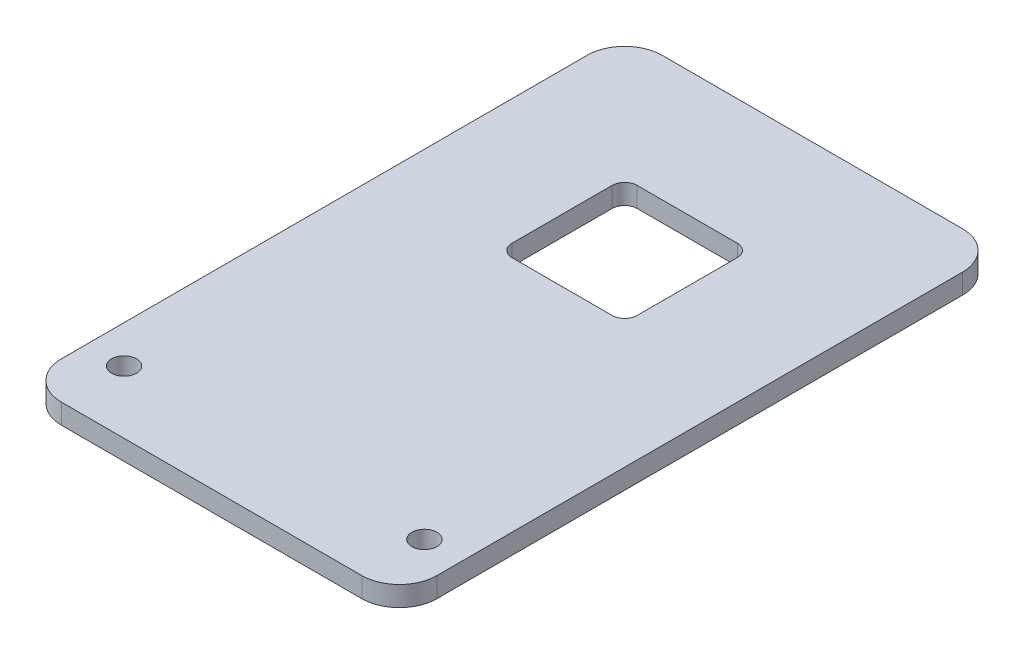
ISO-10303-21;
HEADER;
FILE_DESCRIPTION(('STEP AP214'),'2;1');
FILE_NAME('part.step','',(''),(''),'','','');
FILE_SCHEMA(('AUTOMOTIVE_DESIGN { 1 0 10303 214 1 1 1 1 }'));
ENDSEC;
DATA;
#1=APPLICATION_CONTEXT('core data for automotive mechanical design processes');
#2=APPLICATION_PROTOCOL_DEFINITION('international standard','automotive_design',2000,#1);
#3=PRODUCT_CONTEXT('',#1,'mechanical');
#4=PRODUCT('Part','Part','',(#3));
#5=PRODUCT_RELATED_PRODUCT_CATEGORY('part','',(#4));
#6=PRODUCT_DEFINITION_FORMATION('','',#4);
#7=PRODUCT_DEFINITION_CONTEXT('part definition',#1,'design');
#8=PRODUCT_DEFINITION('design','',#6,#7);
#9=PRODUCT_DEFINITION_SHAPE('','',#8);
#10=(LENGTH_UNIT() NAMED_UNIT(*) SI_UNIT(.MILLI.,.METRE.));
#11=(NAMED_UNIT(*) PLANE_ANGLE_UNIT() SI_UNIT($,.RADIAN.));
#12=(NAMED_UNIT(*) SI_UNIT($,.STERADIAN.) SOLID_ANGLE_UNIT());
#13=UNCERTAINTY_MEASURE_WITH_UNIT(LENGTH_MEASURE(1.E-05),#10,'distance_accuracy_value','');
#14=(GEOMETRIC_REPRESENTATION_CONTEXT(3) GLOBAL_UNCERTAINTY_ASSIGNED_CONTEXT((#13)) GLOBAL_UNIT_ASSIGNED_CONTEXT((#10,
#11,#12)) REPRESENTATION_CONTEXT('',''));
#15=CARTESIAN_POINT('',(0.,0.,0.));
#16=DIRECTION('',(0.,0.,1.));
#17=DIRECTION('',(1.,0.,0.));
#18=AXIS2_PLACEMENT_3D('',#15,#16,#17);
#19=CARTESIAN_POINT('',(0.,1.6,0.));
#20=DIRECTION('',(0.,-1.,0.));
#21=DIRECTION('',(0.,0.,-1.));
#22=AXIS2_PLACEMENT_3D('',#19,#20,#21);
#23=PLANE('',#22);
#24=CARTESIAN_POINT('',(12.,1.6,19.));
#25=DIRECTION('',(0.,1.,0.));
#26=DIRECTION('',(0.,0.,1.));
#27=AXIS2_PLACEMENT_3D('',#24,#25,#26);
#28=CIRCLE('',#27,1.);
#29=CARTESIAN_POINT('',(12.,1.6,20.));
#30=VERTEX_POINT('',#29);
#31=EDGE_CURVE('E283',#30,#30,#28,.T.);
#32=ORIENTED_EDGE('',*,*,#31,.F.);
#33=EDGE_LOOP('',(#32));
#34=FACE_BOUND('',#33,.T.);
#35=CARTESIAN_POINT('',(-12.,1.6,19.));
#36=DIRECTION('',(0.,1.,0.));
#37=DIRECTION('',(0.,0.,1.));
#38=AXIS2_PLACEMENT_3D('',#35,#36,#37);
#39=CIRCLE('',#38,1.);
#40=CARTESIAN_POINT('',(-12.,1.6,20.));
#41=VERTEX_POINT('',#40);
#42=EDGE_CURVE('E289',#41,#41,#39,.T.);
#43=ORIENTED_EDGE('',*,*,#42,.F.);
#44=EDGE_LOOP('',(#43));
#45=FACE_BOUND('',#44,.T.);
#46=DIRECTION('',(-1.,0.,0.));
#47=VECTOR('',#46,1.);
#48=CARTESIAN_POINT('',(-15.,1.6,-24.));
#49=LINE('',#48,#47);
#50=CARTESIAN_POINT('',(12.,1.6,-24.));
#51=VERTEX_POINT('',#50);
#52=CARTESIAN_POINT('',(-12.,1.6,-24.));
#53=VERTEX_POINT('',#52);
#54=EDGE_CURVE('E296',#51,#53,#49,.T.);
#55=ORIENTED_EDGE('',*,*,#54,.T.);
#56=CARTESIAN_POINT('',(-12.,1.6,-21.));
#57=DIRECTION('',(0.,-1.,0.));
#58=DIRECTION('',(0.,0.,-1.));
#59=AXIS2_PLACEMENT_3D('',#56,#57,#58);
#60=CIRCLE('',#59,3.);
#61=CARTESIAN_POINT('',(-15.,1.6,-21.));
#62=VERTEX_POINT('',#61);
#63=EDGE_CURVE('E206',#53,#62,#60,.F.);
#64=ORIENTED_EDGE('',*,*,#63,.T.);
#65=DIRECTION('',(0.,0.,1.));
#66=VECTOR('',#65,1.);
#67=CARTESIAN_POINT('',(-15.,1.6,24.));
#68=LINE('',#67,#66);
#69=CARTESIAN_POINT('',(-15.,1.6,21.));
#70=VERTEX_POINT('',#69);
#71=EDGE_CURVE('E174',#62,#70,#68,.T.);
#72=ORIENTED_EDGE('',*,*,#71,.T.);
#73=CARTESIAN_POINT('',(-12.,1.6,21.));
#74=DIRECTION('',(0.,-1.,0.));
#75=DIRECTION('',(0.,0.,-1.));
#76=AXIS2_PLACEMENT_3D('',#73,#74,#75);
#77=CIRCLE('',#76,3.);
#78=CARTESIAN_POINT('',(-12.,1.6,24.));
#79=VERTEX_POINT('',#78);
#80=EDGE_CURVE('E204',#70,#79,#77,.F.);
#81=ORIENTED_EDGE('',*,*,#80,.T.);
#82=DIRECTION('',(1.,0.,0.));
#83=VECTOR('',#82,1.);
#84=CARTESIAN_POINT('',(-15.,1.6,24.));
#85=LINE('',#84,#83);
#86=CARTESIAN_POINT('',(12.,1.6,24.));
#87=VERTEX_POINT('',#86);
#88=EDGE_CURVE('E191',#79,#87,#85,.T.);
#89=ORIENTED_EDGE('',*,*,#88,.T.);
#90=CARTESIAN_POINT('',(12.,1.6,21.));
#91=DIRECTION('',(0.,-1.,0.));
#92=DIRECTION('',(0.,0.,-1.));
#93=AXIS2_PLACEMENT_3D('',#90,#91,#92);
#94=CIRCLE('',#93,3.);
#95=CARTESIAN_POINT('',(15.,1.6,21.));
#96=VERTEX_POINT('',#95);
#97=EDGE_CURVE('E200',#87,#96,#94,.F.);
#98=ORIENTED_EDGE('',*,*,#97,.T.);
#99=DIRECTION('',(0.,0.,-1.));
#100=VECTOR('',#99,1.);
#101=CARTESIAN_POINT('',(15.,1.6,24.));
#102=LINE('',#101,#100);
#103=CARTESIAN_POINT('',(15.,1.6,-21.));
#104=VERTEX_POINT('',#103);
#105=EDGE_CURVE('E185',#96,#104,#102,.T.);
#106=ORIENTED_EDGE('',*,*,#105,.T.);
#107=CARTESIAN_POINT('',(12.,1.6,-21.));
#108=DIRECTION('',(0.,-1.,0.));
#109=DIRECTION('',(0.,0.,-1.));
#110=AXIS2_PLACEMENT_3D('',#107,#108,#109);
#111=CIRCLE('',#110,3.);
#112=EDGE_CURVE('E202',#104,#51,#111,.F.);
#113=ORIENTED_EDGE('',*,*,#112,.T.);
#114=EDGE_LOOP('',(#55,#64,#72,#81,#89,#98,#106,#113));
#115=FACE_BOUND('',#114,.T.);
#116=DIRECTION('',(0.,0.,-1.));
#117=VECTOR('',#116,1.);
#118=CARTESIAN_POINT('',(5.,1.6,-4.));
#119=LINE('',#118,#117);
#120=CARTESIAN_POINT('',(5.,1.6,-5.));
#121=VERTEX_POINT('',#120);
#122=CARTESIAN_POINT('',(5.,1.6,-13.));
#123=VERTEX_POINT('',#122);
#124=EDGE_CURVE('E265',#121,#123,#119,.T.);
#125=ORIENTED_EDGE('',*,*,#124,.F.);
#126=CARTESIAN_POINT('',(4.,1.6,-5.));
#127=DIRECTION('',(0.,-1.,0.));
#128=DIRECTION('',(0.,0.,-1.));
#129=AXIS2_PLACEMENT_3D('',#126,#127,#128);
#130=CIRCLE('',#129,1.);
#131=CARTESIAN_POINT('',(4.,1.6,-4.));
#132=VERTEX_POINT('',#131);
#133=EDGE_CURVE('E247',#121,#132,#130,.T.);
#134=ORIENTED_EDGE('',*,*,#133,.T.);
#135=DIRECTION('',(1.,0.,0.));
#136=VECTOR('',#135,1.);
#137=CARTESIAN_POINT('',(-5.,1.6,-4.));
#138=LINE('',#137,#136);
#139=CARTESIAN_POINT('',(-4.,1.6,-4.));
#140=VERTEX_POINT('',#139);
#141=EDGE_CURVE('E277',#140,#132,#138,.T.);
#142=ORIENTED_EDGE('',*,*,#141,.F.);
#143=CARTESIAN_POINT('',(-4.,1.6,-5.));
#144=DIRECTION('',(0.,-1.,0.));
#145=DIRECTION('',(0.,0.,-1.));
#146=AXIS2_PLACEMENT_3D('',#143,#144,#145);
#147=CIRCLE('',#146,1.);
#148=CARTESIAN_POINT('',(-5.,1.6,-5.));
#149=VERTEX_POINT('',#148);
#150=EDGE_CURVE('E243',#140,#149,#147,.T.);
#151=ORIENTED_EDGE('',*,*,#150,.T.);
#152=DIRECTION('',(0.,0.,1.));
#153=VECTOR('',#152,1.);
#154=CARTESIAN_POINT('',(-5.,1.6,-4.));
#155=LINE('',#154,#153);
#156=CARTESIAN_POINT('',(-5.,1.6,-13.));
#157=VERTEX_POINT('',#156);
#158=EDGE_CURVE('E270',#157,#149,#155,.T.);
#159=ORIENTED_EDGE('',*,*,#158,.F.);
#160=CARTESIAN_POINT('',(-4.,1.6,-13.));
#161=DIRECTION('',(0.,-1.,0.));
#162=DIRECTION('',(0.,0.,-1.));
#163=AXIS2_PLACEMENT_3D('',#160,#161,#162);
#164=CIRCLE('',#163,1.);
#165=CARTESIAN_POINT('',(-4.,1.6,-14.));
#166=VERTEX_POINT('',#165);
#167=EDGE_CURVE('E239',#157,#166,#164,.T.);
#168=ORIENTED_EDGE('',*,*,#167,.T.);
#169=DIRECTION('',(-1.,0.,0.));
#170=VECTOR('',#169,1.);
#171=CARTESIAN_POINT('',(-5.,1.6,-14.));
#172=LINE('',#171,#170);
#173=CARTESIAN_POINT('',(4.,1.6,-14.));
#174=VERTEX_POINT('',#173);
#175=EDGE_CURVE('E267',#174,#166,#172,.T.);
#176=ORIENTED_EDGE('',*,*,#175,.F.);
#177=CARTESIAN_POINT('',(4.,1.6,-13.));
#178=DIRECTION('',(0.,-1.,0.));
#179=DIRECTION('',(0.,0.,-1.));
#180=AXIS2_PLACEMENT_3D('',#177,#178,#179);
#181=CIRCLE('',#180,1.);
#182=EDGE_CURVE('E11',#174,#123,#181,.T.);
#183=ORIENTED_EDGE('',*,*,#182,.T.);
#184=EDGE_LOOP('',(#125,#134,#142,#151,#159,#168,#176,#183));
#185=FACE_BOUND('',#184,.T.);
#186=ADVANCED_FACE('F41',(#34,#45,#115,#185),#23,.F.);
#187=CARTESIAN_POINT('',(0.,0.,0.));
#188=DIRECTION('',(0.,-1.,0.));
#189=DIRECTION('',(0.,0.,-1.));
#190=AXIS2_PLACEMENT_3D('',#187,#188,#189);
#191=PLANE('',#190);
#192=CARTESIAN_POINT('',(-12.,0.,19.));
#193=DIRECTION('',(0.,1.,0.));
#194=DIRECTION('',(0.,0.,1.));
#195=AXIS2_PLACEMENT_3D('',#192,#193,#194);
#196=CIRCLE('',#195,1.);
#197=CARTESIAN_POINT('',(-12.,0.,20.));
#198=VERTEX_POINT('',#197);
#199=EDGE_CURVE('E286',#198,#198,#196,.T.);
#200=ORIENTED_EDGE('',*,*,#199,.T.);
#201=EDGE_LOOP('',(#200));
#202=FACE_BOUND('',#201,.T.);
#203=DIRECTION('',(0.,0.,1.));
#204=VECTOR('',#203,1.);
#205=CARTESIAN_POINT('',(-15.,0.,24.));
#206=LINE('',#205,#204);
#207=CARTESIAN_POINT('',(-15.,0.,-21.));
#208=VERTEX_POINT('',#207);
#209=CARTESIAN_POINT('',(-15.,0.,21.));
#210=VERTEX_POINT('',#209);
#211=EDGE_CURVE('E171',#208,#210,#206,.T.);
#212=ORIENTED_EDGE('',*,*,#211,.F.);
#213=CARTESIAN_POINT('',(-12.,0.,-21.));
#214=DIRECTION('',(0.,-1.,0.));
#215=DIRECTION('',(0.,0.,-1.));
#216=AXIS2_PLACEMENT_3D('',#213,#214,#215);
#217=CIRCLE('',#216,3.);
#218=CARTESIAN_POINT('',(-12.,0.,-24.));
#219=VERTEX_POINT('',#218);
#220=EDGE_CURVE('E154',#208,#219,#217,.T.);
#221=ORIENTED_EDGE('',*,*,#220,.T.);
#222=DIRECTION('',(-1.,0.,0.));
#223=VECTOR('',#222,1.);
#224=CARTESIAN_POINT('',(-15.,0.,-24.));
#225=LINE('',#224,#223);
#226=CARTESIAN_POINT('',(12.,0.,-24.));
#227=VERTEX_POINT('',#226);
#228=EDGE_CURVE('E182',#227,#219,#225,.T.);
#229=ORIENTED_EDGE('',*,*,#228,.F.);
#230=CARTESIAN_POINT('',(12.,0.,-21.));
#231=DIRECTION('',(0.,-1.,0.));
#232=DIRECTION('',(0.,0.,-1.));
#233=AXIS2_PLACEMENT_3D('',#230,#231,#232);
#234=CIRCLE('',#233,3.);
#235=CARTESIAN_POINT('',(15.,0.,-21.));
#236=VERTEX_POINT('',#235);
#237=EDGE_CURVE('E194',#227,#236,#234,.T.);
#238=ORIENTED_EDGE('',*,*,#237,.T.);
#239=DIRECTION('',(0.,0.,-1.));
#240=VECTOR('',#239,1.);
#241=CARTESIAN_POINT('',(15.,0.,24.));
#242=LINE('',#241,#240);
#243=CARTESIAN_POINT('',(15.,0.,21.));
#244=VERTEX_POINT('',#243);
#245=EDGE_CURVE('E187',#244,#236,#242,.T.);
#246=ORIENTED_EDGE('',*,*,#245,.F.);
#247=CARTESIAN_POINT('',(12.,0.,21.));
#248=DIRECTION('',(0.,-1.,0.));
#249=DIRECTION('',(0.,0.,-1.));
#250=AXIS2_PLACEMENT_3D('',#247,#248,#249);
#251=CIRCLE('',#250,3.);
#252=CARTESIAN_POINT('',(12.,0.,24.));
#253=VERTEX_POINT('',#252);
#254=EDGE_CURVE('E175',#244,#253,#251,.T.);
#255=ORIENTED_EDGE('',*,*,#254,.T.);
#256=DIRECTION('',(1.,0.,0.));
#257=VECTOR('',#256,1.);
#258=CARTESIAN_POINT('',(-15.,0.,24.));
#259=LINE('',#258,#257);
#260=CARTESIAN_POINT('',(-12.,0.,24.));
#261=VERTEX_POINT('',#260);
#262=EDGE_CURVE('E181',#261,#253,#259,.T.);
#263=ORIENTED_EDGE('',*,*,#262,.F.);
#264=CARTESIAN_POINT('',(-12.,0.,21.));
#265=DIRECTION('',(0.,-1.,0.));
#266=DIRECTION('',(0.,0.,-1.));
#267=AXIS2_PLACEMENT_3D('',#264,#265,#266);
#268=CIRCLE('',#267,3.);
#269=EDGE_CURVE('E165',#261,#210,#268,.T.);
#270=ORIENTED_EDGE('',*,*,#269,.T.);
#271=EDGE_LOOP('',(#212,#221,#229,#238,#246,#255,#263,#270));
#272=FACE_BOUND('',#271,.T.);
#273=CARTESIAN_POINT('',(12.,0.,19.));
#274=DIRECTION('',(0.,1.,0.));
#275=DIRECTION('',(0.,0.,1.));
#276=AXIS2_PLACEMENT_3D('',#273,#274,#275);
#277=CIRCLE('',#276,1.);
#278=CARTESIAN_POINT('',(12.,0.,20.));
#279=VERTEX_POINT('',#278);
#280=EDGE_CURVE('E280',#279,#279,#277,.T.);
#281=ORIENTED_EDGE('',*,*,#280,.T.);
#282=EDGE_LOOP('',(#281));
#283=FACE_BOUND('',#282,.T.);
#284=DIRECTION('',(0.,0.,1.));
#285=VECTOR('',#284,1.);
#286=CARTESIAN_POINT('',(-5.,0.,-4.));
#287=LINE('',#286,#285);
#288=CARTESIAN_POINT('',(-5.,0.,-13.));
#289=VERTEX_POINT('',#288);
#290=CARTESIAN_POINT('',(-5.,0.,-5.));
#291=VERTEX_POINT('',#290);
#292=EDGE_CURVE('E262',#289,#291,#287,.T.);
#293=ORIENTED_EDGE('',*,*,#292,.T.);
#294=CARTESIAN_POINT('',(-4.,0.,-5.));
#295=DIRECTION('',(0.,-1.,0.));
#296=DIRECTION('',(0.,0.,-1.));
#297=AXIS2_PLACEMENT_3D('',#294,#295,#296);
#298=CIRCLE('',#297,1.);
#299=CARTESIAN_POINT('',(-4.,0.,-4.));
#300=VERTEX_POINT('',#299);
#301=EDGE_CURVE('E241',#291,#300,#298,.F.);
#302=ORIENTED_EDGE('',*,*,#301,.T.);
#303=DIRECTION('',(1.,0.,0.));
#304=VECTOR('',#303,1.);
#305=CARTESIAN_POINT('',(-5.,0.,-4.));
#306=LINE('',#305,#304);
#307=CARTESIAN_POINT('',(4.,0.,-4.));
#308=VERTEX_POINT('',#307);
#309=EDGE_CURVE('E268',#300,#308,#306,.T.);
#310=ORIENTED_EDGE('',*,*,#309,.T.);
#311=CARTESIAN_POINT('',(4.,0.,-5.));
#312=DIRECTION('',(0.,-1.,0.));
#313=DIRECTION('',(0.,0.,-1.));
#314=AXIS2_PLACEMENT_3D('',#311,#312,#313);
#315=CIRCLE('',#314,1.);
#316=CARTESIAN_POINT('',(5.,0.,-5.));
#317=VERTEX_POINT('',#316);
#318=EDGE_CURVE('E245',#308,#317,#315,.F.);
#319=ORIENTED_EDGE('',*,*,#318,.T.);
#320=DIRECTION('',(0.,0.,-1.));
#321=VECTOR('',#320,1.);
#322=CARTESIAN_POINT('',(5.,0.,-4.));
#323=LINE('',#322,#321);
#324=CARTESIAN_POINT('',(5.,0.,-13.));
#325=VERTEX_POINT('',#324);
#326=EDGE_CURVE('E254',#317,#325,#323,.T.);
#327=ORIENTED_EDGE('',*,*,#326,.T.);
#328=CARTESIAN_POINT('',(4.,0.,-13.));
#329=DIRECTION('',(0.,-1.,0.));
#330=DIRECTION('',(0.,0.,-1.));
#331=AXIS2_PLACEMENT_3D('',#328,#329,#330);
#332=CIRCLE('',#331,1.);
#333=CARTESIAN_POINT('',(4.,0.,-14.));
#334=VERTEX_POINT('',#333);
#335=EDGE_CURVE('E49',#325,#334,#332,.F.);
#336=ORIENTED_EDGE('',*,*,#335,.T.);
#337=DIRECTION('',(-1.,0.,0.));
#338=VECTOR('',#337,1.);
#339=CARTESIAN_POINT('',(-5.,0.,-14.));
#340=LINE('',#339,#338);
#341=CARTESIAN_POINT('',(-4.,0.,-14.));
#342=VERTEX_POINT('',#341);
#343=EDGE_CURVE('E253',#334,#342,#340,.T.);
#344=ORIENTED_EDGE('',*,*,#343,.T.);
#345=CARTESIAN_POINT('',(-4.,0.,-13.));
#346=DIRECTION('',(0.,-1.,0.));
#347=DIRECTION('',(0.,0.,-1.));
#348=AXIS2_PLACEMENT_3D('',#345,#346,#347);
#349=CIRCLE('',#348,1.);
#350=EDGE_CURVE('E237',#342,#289,#349,.F.);
#351=ORIENTED_EDGE('',*,*,#350,.T.);
#352=EDGE_LOOP('',(#293,#302,#310,#319,#327,#336,#344,#351));
#353=FACE_BOUND('',#352,.T.);
#354=ADVANCED_FACE('F178',(#202,#272,#283,#353),#191,.T.);
#355=CARTESIAN_POINT('',(15.,1.6,24.));
#356=DIRECTION('',(-1.,0.,0.));
#357=DIRECTION('',(0.,0.,1.));
#358=AXIS2_PLACEMENT_3D('',#355,#356,#357);
#359=PLANE('',#358);
#360=ORIENTED_EDGE('',*,*,#245,.T.);
#361=DIRECTION('',(0.,-1.,0.));
#362=VECTOR('',#361,1.);
#363=CARTESIAN_POINT('',(15.,1.6,-21.));
#364=LINE('',#363,#362);
#365=EDGE_CURVE('E216',#236,#104,#364,.F.);
#366=ORIENTED_EDGE('',*,*,#365,.T.);
#367=ORIENTED_EDGE('',*,*,#105,.F.);
#368=DIRECTION('',(0.,-1.,0.));
#369=VECTOR('',#368,1.);
#370=CARTESIAN_POINT('',(15.,1.6,21.));
#371=LINE('',#370,#369);
#372=EDGE_CURVE('E213',#96,#244,#371,.T.);
#373=ORIENTED_EDGE('',*,*,#372,.T.);
#374=EDGE_LOOP('',(#360,#366,#367,#373));
#375=FACE_BOUND('',#374,.T.);
#376=ADVANCED_FACE('F305',(#375),#359,.F.);
#377=CARTESIAN_POINT('',(-15.,1.6,-24.));
#378=DIRECTION('',(0.,0.,1.));
#379=DIRECTION('',(1.,0.,0.));
#380=AXIS2_PLACEMENT_3D('',#377,#378,#379);
#381=PLANE('',#380);
#382=ORIENTED_EDGE('',*,*,#228,.T.);
#383=DIRECTION('',(0.,-1.,0.));
#384=VECTOR('',#383,1.);
#385=CARTESIAN_POINT('',(-12.,1.6,-24.));
#386=LINE('',#385,#384);
#387=EDGE_CURVE('E159',#219,#53,#386,.F.);
#388=ORIENTED_EDGE('',*,*,#387,.T.);
#389=ORIENTED_EDGE('',*,*,#54,.F.);
#390=DIRECTION('',(0.,-1.,0.));
#391=VECTOR('',#390,1.);
#392=CARTESIAN_POINT('',(12.,1.6,-24.));
#393=LINE('',#392,#391);
#394=EDGE_CURVE('E164',#51,#227,#393,.T.);
#395=ORIENTED_EDGE('',*,*,#394,.T.);
#396=EDGE_LOOP('',(#382,#388,#389,#395));
#397=FACE_BOUND('',#396,.T.);
#398=ADVANCED_FACE('F315',(#397),#381,.F.);
#399=CARTESIAN_POINT('',(-15.,1.6,24.));
#400=DIRECTION('',(1.,0.,0.));
#401=DIRECTION('',(0.,0.,-1.));
#402=AXIS2_PLACEMENT_3D('',#399,#400,#401);
#403=PLANE('',#402);
#404=ORIENTED_EDGE('',*,*,#71,.F.);
#405=DIRECTION('',(0.,-1.,0.));
#406=VECTOR('',#405,1.);
#407=CARTESIAN_POINT('',(-15.,1.6,-21.));
#408=LINE('',#407,#406);
#409=EDGE_CURVE('E158',#62,#208,#408,.T.);
#410=ORIENTED_EDGE('',*,*,#409,.T.);
#411=ORIENTED_EDGE('',*,*,#211,.T.);
#412=DIRECTION('',(0.,-1.,0.));
#413=VECTOR('',#412,1.);
#414=CARTESIAN_POINT('',(-15.,1.6,21.));
#415=LINE('',#414,#413);
#416=EDGE_CURVE('E176',#210,#70,#415,.F.);
#417=ORIENTED_EDGE('',*,*,#416,.T.);
#418=EDGE_LOOP('',(#404,#410,#411,#417));
#419=FACE_BOUND('',#418,.T.);
#420=ADVANCED_FACE('F170',(#419),#403,.F.);
#421=CARTESIAN_POINT('',(-15.,1.6,24.));
#422=DIRECTION('',(0.,0.,-1.));
#423=DIRECTION('',(-1.,0.,0.));
#424=AXIS2_PLACEMENT_3D('',#421,#422,#423);
#425=PLANE('',#424);
#426=ORIENTED_EDGE('',*,*,#88,.F.);
#427=DIRECTION('',(0.,-1.,0.));
#428=VECTOR('',#427,1.);
#429=CARTESIAN_POINT('',(-12.,1.6,24.));
#430=LINE('',#429,#428);
#431=EDGE_CURVE('E210',#79,#261,#430,.T.);
#432=ORIENTED_EDGE('',*,*,#431,.T.);
#433=ORIENTED_EDGE('',*,*,#262,.T.);
#434=DIRECTION('',(0.,-1.,0.));
#435=VECTOR('',#434,1.);
#436=CARTESIAN_POINT('',(12.,1.6,24.));
#437=LINE('',#436,#435);
#438=EDGE_CURVE('E208',#253,#87,#437,.F.);
#439=ORIENTED_EDGE('',*,*,#438,.T.);
#440=EDGE_LOOP('',(#426,#432,#433,#439));
#441=FACE_BOUND('',#440,.T.);
#442=ADVANCED_FACE('F322',(#441),#425,.F.);
#443=CARTESIAN_POINT('',(-12.,1.6,19.));
#444=DIRECTION('',(0.,-1.,0.));
#445=DIRECTION('',(0.,0.,-1.));
#446=AXIS2_PLACEMENT_3D('',#443,#444,#445);
#447=CYLINDRICAL_SURFACE('',#446,1.);
#448=ORIENTED_EDGE('',*,*,#42,.T.);
#449=EDGE_LOOP('',(#448));
#450=FACE_BOUND('',#449,.T.);
#451=ORIENTED_EDGE('',*,*,#199,.F.);
#452=EDGE_LOOP('',(#451));
#453=FACE_BOUND('',#452,.T.);
#454=ADVANCED_FACE('F337',(#450,#453),#447,.F.);
#455=CARTESIAN_POINT('',(12.,1.6,19.));
#456=DIRECTION('',(0.,-1.,0.));
#457=DIRECTION('',(0.,0.,-1.));
#458=AXIS2_PLACEMENT_3D('',#455,#456,#457);
#459=CYLINDRICAL_SURFACE('',#458,1.);
#460=ORIENTED_EDGE('',*,*,#31,.T.);
#461=EDGE_LOOP('',(#460));
#462=FACE_BOUND('',#461,.T.);
#463=ORIENTED_EDGE('',*,*,#280,.F.);
#464=EDGE_LOOP('',(#463));
#465=FACE_BOUND('',#464,.T.);
#466=ADVANCED_FACE('F346',(#462,#465),#459,.F.);
#467=CARTESIAN_POINT('',(5.,1.6,-4.));
#468=DIRECTION('',(-1.,0.,0.));
#469=DIRECTION('',(0.,0.,1.));
#470=AXIS2_PLACEMENT_3D('',#467,#468,#469);
#471=PLANE('',#470);
#472=ORIENTED_EDGE('',*,*,#326,.F.);
#473=DIRECTION('',(0.,-1.,0.));
#474=VECTOR('',#473,1.);
#475=CARTESIAN_POINT('',(5.,1.6,-5.));
#476=LINE('',#475,#474);
#477=EDGE_CURVE('E61',#317,#121,#476,.F.);
#478=ORIENTED_EDGE('',*,*,#477,.T.);
#479=ORIENTED_EDGE('',*,*,#124,.T.);
#480=DIRECTION('',(0.,-1.,0.));
#481=VECTOR('',#480,1.);
#482=CARTESIAN_POINT('',(5.,0.,-13.));
#483=LINE('',#482,#481);
#484=EDGE_CURVE('E233',#123,#325,#483,.T.);
#485=ORIENTED_EDGE('',*,*,#484,.T.);
#486=EDGE_LOOP('',(#472,#478,#479,#485));
#487=FACE_BOUND('',#486,.T.);
#488=ADVANCED_FACE('F264',(#487),#471,.T.);
#489=CARTESIAN_POINT('',(-5.,1.6,-14.));
#490=DIRECTION('',(0.,0.,1.));
#491=DIRECTION('',(1.,0.,0.));
#492=AXIS2_PLACEMENT_3D('',#489,#490,#491);
#493=PLANE('',#492);
#494=ORIENTED_EDGE('',*,*,#175,.T.);
#495=DIRECTION('',(0.,-1.,0.));
#496=VECTOR('',#495,1.);
#497=CARTESIAN_POINT('',(-4.,0.,-14.));
#498=LINE('',#497,#496);
#499=EDGE_CURVE('E220',#166,#342,#498,.T.);
#500=ORIENTED_EDGE('',*,*,#499,.T.);
#501=ORIENTED_EDGE('',*,*,#343,.F.);
#502=DIRECTION('',(0.,-1.,0.));
#503=VECTOR('',#502,1.);
#504=CARTESIAN_POINT('',(4.,1.6,-14.));
#505=LINE('',#504,#503);
#506=EDGE_CURVE('E218',#334,#174,#505,.F.);
#507=ORIENTED_EDGE('',*,*,#506,.T.);
#508=EDGE_LOOP('',(#494,#500,#501,#507));
#509=FACE_BOUND('',#508,.T.);
#510=ADVANCED_FACE('F260',(#509),#493,.T.);
#511=CARTESIAN_POINT('',(-5.,1.6,-4.));
#512=DIRECTION('',(1.,0.,0.));
#513=DIRECTION('',(0.,0.,-1.));
#514=AXIS2_PLACEMENT_3D('',#511,#512,#513);
#515=PLANE('',#514);
#516=ORIENTED_EDGE('',*,*,#292,.F.);
#517=DIRECTION('',(0.,-1.,0.));
#518=VECTOR('',#517,1.);
#519=CARTESIAN_POINT('',(-5.,1.6,-13.));
#520=LINE('',#519,#518);
#521=EDGE_CURVE('E226',#289,#157,#520,.F.);
#522=ORIENTED_EDGE('',*,*,#521,.T.);
#523=ORIENTED_EDGE('',*,*,#158,.T.);
#524=DIRECTION('',(0.,-1.,0.));
#525=VECTOR('',#524,1.);
#526=CARTESIAN_POINT('',(-5.,0.,-5.));
#527=LINE('',#526,#525);
#528=EDGE_CURVE('E223',#149,#291,#527,.T.);
#529=ORIENTED_EDGE('',*,*,#528,.T.);
#530=EDGE_LOOP('',(#516,#522,#523,#529));
#531=FACE_BOUND('',#530,.T.);
#532=ADVANCED_FACE('F391',(#531),#515,.T.);
#533=CARTESIAN_POINT('',(-5.,1.6,-4.));
#534=DIRECTION('',(0.,0.,-1.));
#535=DIRECTION('',(-1.,0.,0.));
#536=AXIS2_PLACEMENT_3D('',#533,#534,#535);
#537=PLANE('',#536);
#538=ORIENTED_EDGE('',*,*,#309,.F.);
#539=DIRECTION('',(0.,-1.,0.));
#540=VECTOR('',#539,1.);
#541=CARTESIAN_POINT('',(-4.,1.6,-4.));
#542=LINE('',#541,#540);
#543=EDGE_CURVE('E231',#300,#140,#542,.F.);
#544=ORIENTED_EDGE('',*,*,#543,.T.);
#545=ORIENTED_EDGE('',*,*,#141,.T.);
#546=DIRECTION('',(0.,-1.,0.));
#547=VECTOR('',#546,1.);
#548=CARTESIAN_POINT('',(4.,0.,-4.));
#549=LINE('',#548,#547);
#550=EDGE_CURVE('E228',#132,#308,#549,.T.);
#551=ORIENTED_EDGE('',*,*,#550,.T.);
#552=EDGE_LOOP('',(#538,#544,#545,#551));
#553=FACE_BOUND('',#552,.T.);
#554=ADVANCED_FACE('F362',(#553),#537,.T.);
#555=CARTESIAN_POINT('',(-12.,1.6,-21.));
#556=DIRECTION('',(0.,-1.,0.));
#557=DIRECTION('',(0.,0.,-1.));
#558=AXIS2_PLACEMENT_3D('',#555,#556,#557);
#559=CYLINDRICAL_SURFACE('',#558,3.);
#560=ORIENTED_EDGE('',*,*,#63,.F.);
#561=ORIENTED_EDGE('',*,*,#387,.F.);
#562=ORIENTED_EDGE('',*,*,#220,.F.);
#563=ORIENTED_EDGE('',*,*,#409,.F.);
#564=EDGE_LOOP('',(#560,#561,#562,#563));
#565=FACE_BOUND('',#564,.T.);
#566=ADVANCED_FACE('F157',(#565),#559,.T.);
#567=CARTESIAN_POINT('',(-12.,1.6,21.));
#568=DIRECTION('',(0.,-1.,0.));
#569=DIRECTION('',(0.,0.,-1.));
#570=AXIS2_PLACEMENT_3D('',#567,#568,#569);
#571=CYLINDRICAL_SURFACE('',#570,3.);
#572=ORIENTED_EDGE('',*,*,#80,.F.);
#573=ORIENTED_EDGE('',*,*,#416,.F.);
#574=ORIENTED_EDGE('',*,*,#269,.F.);
#575=ORIENTED_EDGE('',*,*,#431,.F.);
#576=EDGE_LOOP('',(#572,#573,#574,#575));
#577=FACE_BOUND('',#576,.T.);
#578=ADVANCED_FACE('F354',(#577),#571,.T.);
#579=CARTESIAN_POINT('',(12.,1.6,-21.));
#580=DIRECTION('',(0.,-1.,0.));
#581=DIRECTION('',(0.,0.,-1.));
#582=AXIS2_PLACEMENT_3D('',#579,#580,#581);
#583=CYLINDRICAL_SURFACE('',#582,3.);
#584=ORIENTED_EDGE('',*,*,#112,.F.);
#585=ORIENTED_EDGE('',*,*,#365,.F.);
#586=ORIENTED_EDGE('',*,*,#237,.F.);
#587=ORIENTED_EDGE('',*,*,#394,.F.);
#588=EDGE_LOOP('',(#584,#585,#586,#587));
#589=FACE_BOUND('',#588,.T.);
#590=ADVANCED_FACE('F310',(#589),#583,.T.);
#591=CARTESIAN_POINT('',(12.,1.6,21.));
#592=DIRECTION('',(0.,-1.,0.));
#593=DIRECTION('',(0.,0.,-1.));
#594=AXIS2_PLACEMENT_3D('',#591,#592,#593);
#595=CYLINDRICAL_SURFACE('',#594,3.);
#596=ORIENTED_EDGE('',*,*,#97,.F.);
#597=ORIENTED_EDGE('',*,*,#438,.F.);
#598=ORIENTED_EDGE('',*,*,#254,.F.);
#599=ORIENTED_EDGE('',*,*,#372,.F.);
#600=EDGE_LOOP('',(#596,#597,#598,#599));
#601=FACE_BOUND('',#600,.T.);
#602=ADVANCED_FACE('F360',(#601),#595,.T.);
#603=CARTESIAN_POINT('',(-4.,1.6,-13.));
#604=DIRECTION('',(0.,1.,0.));
#605=DIRECTION('',(0.,0.,1.));
#606=AXIS2_PLACEMENT_3D('',#603,#604,#605);
#607=CYLINDRICAL_SURFACE('',#606,1.);
#608=ORIENTED_EDGE('',*,*,#167,.F.);
#609=ORIENTED_EDGE('',*,*,#521,.F.);
#610=ORIENTED_EDGE('',*,*,#350,.F.);
#611=ORIENTED_EDGE('',*,*,#499,.F.);
#612=EDGE_LOOP('',(#608,#609,#610,#611));
#613=FACE_BOUND('',#612,.T.);
#614=ADVANCED_FACE('F366',(#613),#607,.F.);
#615=CARTESIAN_POINT('',(-4.,1.6,-5.));
#616=DIRECTION('',(0.,1.,0.));
#617=DIRECTION('',(0.,0.,1.));
#618=AXIS2_PLACEMENT_3D('',#615,#616,#617);
#619=CYLINDRICAL_SURFACE('',#618,1.);
#620=ORIENTED_EDGE('',*,*,#150,.F.);
#621=ORIENTED_EDGE('',*,*,#543,.F.);
#622=ORIENTED_EDGE('',*,*,#301,.F.);
#623=ORIENTED_EDGE('',*,*,#528,.F.);
#624=EDGE_LOOP('',(#620,#621,#622,#623));
#625=FACE_BOUND('',#624,.T.);
#626=ADVANCED_FACE('F370',(#625),#619,.F.);
#627=CARTESIAN_POINT('',(4.,1.6,-5.));
#628=DIRECTION('',(0.,1.,0.));
#629=DIRECTION('',(0.,0.,1.));
#630=AXIS2_PLACEMENT_3D('',#627,#628,#629);
#631=CYLINDRICAL_SURFACE('',#630,1.);
#632=ORIENTED_EDGE('',*,*,#133,.F.);
#633=ORIENTED_EDGE('',*,*,#477,.F.);
#634=ORIENTED_EDGE('',*,*,#318,.F.);
#635=ORIENTED_EDGE('',*,*,#550,.F.);
#636=EDGE_LOOP('',(#632,#633,#634,#635));
#637=FACE_BOUND('',#636,.T.);
#638=ADVANCED_FACE('F373',(#637),#631,.F.);
#639=CARTESIAN_POINT('',(4.,1.6,-13.));
#640=DIRECTION('',(0.,1.,0.));
#641=DIRECTION('',(0.,0.,1.));
#642=AXIS2_PLACEMENT_3D('',#639,#640,#641);
#643=CYLINDRICAL_SURFACE('',#642,1.);
#644=ORIENTED_EDGE('',*,*,#182,.F.);
#645=ORIENTED_EDGE('',*,*,#506,.F.);
#646=ORIENTED_EDGE('',*,*,#335,.F.);
#647=ORIENTED_EDGE('',*,*,#484,.F.);
#648=EDGE_LOOP('',(#644,#645,#646,#647));
#649=FACE_BOUND('',#648,.T.);
#650=ADVANCED_FACE('F43',(#649),#643,.F.);
#651=CLOSED_SHELL('',(#186,#354,#376,#398,#420,#442,#454,#466,#488,#510,#532,#554,#566,#578,
#590,#602,#614,#626,#638,#650));
#652=MANIFOLD_SOLID_BREP('B2',#651);
#653=ADVANCED_BREP_SHAPE_REPRESENTATION('',(#18,#652),#14);
#654=SHAPE_DEFINITION_REPRESENTATION(#9,#653);
ENDSEC;
END-ISO-10303-21;
